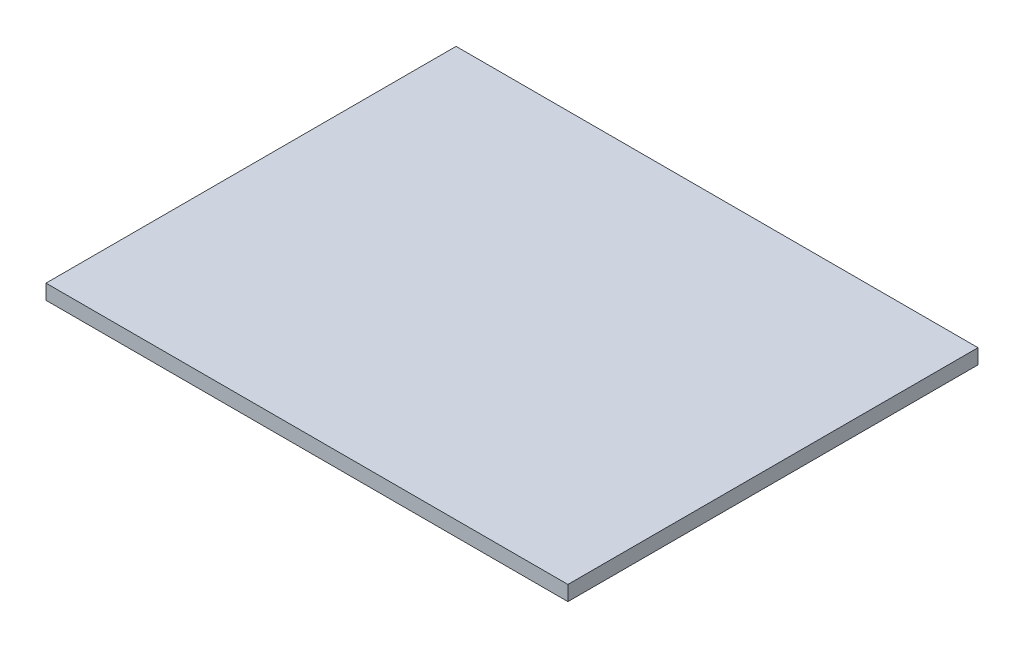
ISO-10303-21;
HEADER;
FILE_DESCRIPTION(('STEP AP214'),'2;1');
FILE_NAME('part.step','',(''),(''),'','','');
FILE_SCHEMA(('AUTOMOTIVE_DESIGN { 1 0 10303 214 1 1 1 1 }'));
ENDSEC;
DATA;
#1=APPLICATION_CONTEXT('core data for automotive mechanical design processes');
#2=APPLICATION_PROTOCOL_DEFINITION('international standard','automotive_design',2000,#1);
#3=PRODUCT_CONTEXT('',#1,'mechanical');
#4=PRODUCT('Part','Part','',(#3));
#5=PRODUCT_RELATED_PRODUCT_CATEGORY('part','',(#4));
#6=PRODUCT_DEFINITION_FORMATION('','',#4);
#7=PRODUCT_DEFINITION_CONTEXT('part definition',#1,'design');
#8=PRODUCT_DEFINITION('design','',#6,#7);
#9=PRODUCT_DEFINITION_SHAPE('','',#8);
#10=(LENGTH_UNIT() NAMED_UNIT(*) SI_UNIT(.MILLI.,.METRE.));
#11=(NAMED_UNIT(*) PLANE_ANGLE_UNIT() SI_UNIT($,.RADIAN.));
#12=(NAMED_UNIT(*) SI_UNIT($,.STERADIAN.) SOLID_ANGLE_UNIT());
#13=UNCERTAINTY_MEASURE_WITH_UNIT(LENGTH_MEASURE(1.E-05),#10,'distance_accuracy_value','');
#14=(GEOMETRIC_REPRESENTATION_CONTEXT(3) GLOBAL_UNCERTAINTY_ASSIGNED_CONTEXT((#13)) GLOBAL_UNIT_ASSIGNED_CONTEXT((#10,
#11,#12)) REPRESENTATION_CONTEXT('',''));
#15=CARTESIAN_POINT('',(0.,0.,0.));
#16=DIRECTION('',(0.,0.,1.));
#17=DIRECTION('',(1.,0.,0.));
#18=AXIS2_PLACEMENT_3D('',#15,#16,#17);
#19=CARTESIAN_POINT('',(-35.,2.,-27.5));
#20=DIRECTION('',(1.,0.,0.));
#21=DIRECTION('',(0.,0.,-1.));
#22=AXIS2_PLACEMENT_3D('',#19,#20,#21);
#23=PLANE('',#22);
#24=DIRECTION('',(0.,0.,1.));
#25=VECTOR('',#24,1.);
#26=CARTESIAN_POINT('',(-35.,0.,-27.5));
#27=LINE('',#26,#25);
#28=CARTESIAN_POINT('',(-35.,0.,-27.5));
#29=VERTEX_POINT('',#28);
#30=CARTESIAN_POINT('',(-35.,0.,27.5));
#31=VERTEX_POINT('',#30);
#32=EDGE_CURVE('E107',#29,#31,#27,.T.);
#33=ORIENTED_EDGE('',*,*,#32,.T.);
#34=DIRECTION('',(0.,-1.,0.));
#35=VECTOR('',#34,1.);
#36=CARTESIAN_POINT('',(-35.,2.,27.5));
#37=LINE('',#36,#35);
#38=CARTESIAN_POINT('',(-35.,2.,27.5));
#39=VERTEX_POINT('',#38);
#40=EDGE_CURVE('E11',#39,#31,#37,.T.);
#41=ORIENTED_EDGE('',*,*,#40,.F.);
#42=DIRECTION('',(0.,0.,1.));
#43=VECTOR('',#42,1.);
#44=CARTESIAN_POINT('',(-35.,2.,-27.5));
#45=LINE('',#44,#43);
#46=CARTESIAN_POINT('',(-35.,2.,-27.5));
#47=VERTEX_POINT('',#46);
#48=EDGE_CURVE('E91',#47,#39,#45,.T.);
#49=ORIENTED_EDGE('',*,*,#48,.F.);
#50=DIRECTION('',(0.,-1.,0.));
#51=VECTOR('',#50,1.);
#52=CARTESIAN_POINT('',(-35.,2.,-27.5));
#53=LINE('',#52,#51);
#54=EDGE_CURVE('E103',#47,#29,#53,.T.);
#55=ORIENTED_EDGE('',*,*,#54,.T.);
#56=EDGE_LOOP('',(#33,#41,#49,#55));
#57=FACE_BOUND('',#56,.T.);
#58=ADVANCED_FACE('F39',(#57),#23,.F.);
#59=CARTESIAN_POINT('',(-35.,2.,27.5));
#60=DIRECTION('',(0.,0.,-1.));
#61=DIRECTION('',(-1.,0.,0.));
#62=AXIS2_PLACEMENT_3D('',#59,#60,#61);
#63=PLANE('',#62);
#64=DIRECTION('',(1.,0.,0.));
#65=VECTOR('',#64,1.);
#66=CARTESIAN_POINT('',(-35.,0.,27.5));
#67=LINE('',#66,#65);
#68=CARTESIAN_POINT('',(35.,0.,27.5));
#69=VERTEX_POINT('',#68);
#70=EDGE_CURVE('E96',#31,#69,#67,.T.);
#71=ORIENTED_EDGE('',*,*,#70,.T.);
#72=DIRECTION('',(0.,-1.,0.));
#73=VECTOR('',#72,1.);
#74=CARTESIAN_POINT('',(35.,2.,27.5));
#75=LINE('',#74,#73);
#76=CARTESIAN_POINT('',(35.,2.,27.5));
#77=VERTEX_POINT('',#76);
#78=EDGE_CURVE('E48',#77,#69,#75,.T.);
#79=ORIENTED_EDGE('',*,*,#78,.F.);
#80=DIRECTION('',(1.,0.,0.));
#81=VECTOR('',#80,1.);
#82=CARTESIAN_POINT('',(-35.,2.,27.5));
#83=LINE('',#82,#81);
#84=EDGE_CURVE('E86',#39,#77,#83,.T.);
#85=ORIENTED_EDGE('',*,*,#84,.F.);
#86=ORIENTED_EDGE('',*,*,#40,.T.);
#87=EDGE_LOOP('',(#71,#79,#85,#86));
#88=FACE_BOUND('',#87,.T.);
#89=ADVANCED_FACE('F95',(#88),#63,.F.);
#90=CARTESIAN_POINT('',(35.,2.,-27.5));
#91=DIRECTION('',(-1.,0.,0.));
#92=DIRECTION('',(0.,0.,1.));
#93=AXIS2_PLACEMENT_3D('',#90,#91,#92);
#94=PLANE('',#93);
#95=DIRECTION('',(0.,0.,-1.));
#96=VECTOR('',#95,1.);
#97=CARTESIAN_POINT('',(35.,0.,-27.5));
#98=LINE('',#97,#96);
#99=CARTESIAN_POINT('',(35.,0.,-27.5));
#100=VERTEX_POINT('',#99);
#101=EDGE_CURVE('E73',#69,#100,#98,.T.);
#102=ORIENTED_EDGE('',*,*,#101,.T.);
#103=DIRECTION('',(0.,-1.,0.));
#104=VECTOR('',#103,1.);
#105=CARTESIAN_POINT('',(35.,2.,-27.5));
#106=LINE('',#105,#104);
#107=CARTESIAN_POINT('',(35.,2.,-27.5));
#108=VERTEX_POINT('',#107);
#109=EDGE_CURVE('E98',#108,#100,#106,.T.);
#110=ORIENTED_EDGE('',*,*,#109,.F.);
#111=DIRECTION('',(0.,0.,-1.));
#112=VECTOR('',#111,1.);
#113=CARTESIAN_POINT('',(35.,2.,-27.5));
#114=LINE('',#113,#112);
#115=EDGE_CURVE('E89',#77,#108,#114,.T.);
#116=ORIENTED_EDGE('',*,*,#115,.F.);
#117=ORIENTED_EDGE('',*,*,#78,.T.);
#118=EDGE_LOOP('',(#102,#110,#116,#117));
#119=FACE_BOUND('',#118,.T.);
#120=ADVANCED_FACE('F99',(#119),#94,.F.);
#121=CARTESIAN_POINT('',(-35.,2.,-27.5));
#122=DIRECTION('',(0.,0.,1.));
#123=DIRECTION('',(1.,0.,0.));
#124=AXIS2_PLACEMENT_3D('',#121,#122,#123);
#125=PLANE('',#124);
#126=DIRECTION('',(-1.,0.,0.));
#127=VECTOR('',#126,1.);
#128=CARTESIAN_POINT('',(-35.,0.,-27.5));
#129=LINE('',#128,#127);
#130=EDGE_CURVE('E79',#100,#29,#129,.T.);
#131=ORIENTED_EDGE('',*,*,#130,.T.);
#132=ORIENTED_EDGE('',*,*,#54,.F.);
#133=DIRECTION('',(-1.,0.,0.));
#134=VECTOR('',#133,1.);
#135=CARTESIAN_POINT('',(-35.,2.,-27.5));
#136=LINE('',#135,#134);
#137=EDGE_CURVE('E56',#108,#47,#136,.T.);
#138=ORIENTED_EDGE('',*,*,#137,.F.);
#139=ORIENTED_EDGE('',*,*,#109,.T.);
#140=EDGE_LOOP('',(#131,#132,#138,#139));
#141=FACE_BOUND('',#140,.T.);
#142=ADVANCED_FACE('F120',(#141),#125,.F.);
#143=CARTESIAN_POINT('',(0.,2.,0.));
#144=DIRECTION('',(0.,1.,0.));
#145=DIRECTION('',(0.,0.,1.));
#146=AXIS2_PLACEMENT_3D('',#143,#144,#145);
#147=PLANE('',#146);
#148=ORIENTED_EDGE('',*,*,#48,.T.);
#149=ORIENTED_EDGE('',*,*,#84,.T.);
#150=ORIENTED_EDGE('',*,*,#115,.T.);
#151=ORIENTED_EDGE('',*,*,#137,.T.);
#152=EDGE_LOOP('',(#148,#149,#150,#151));
#153=FACE_BOUND('',#152,.T.);
#154=ADVANCED_FACE('F87',(#153),#147,.T.);
#155=CARTESIAN_POINT('',(0.,0.,0.));
#156=DIRECTION('',(0.,1.,0.));
#157=DIRECTION('',(0.,0.,1.));
#158=AXIS2_PLACEMENT_3D('',#155,#156,#157);
#159=PLANE('',#158);
#160=ORIENTED_EDGE('',*,*,#32,.F.);
#161=ORIENTED_EDGE('',*,*,#130,.F.);
#162=ORIENTED_EDGE('',*,*,#101,.F.);
#163=ORIENTED_EDGE('',*,*,#70,.F.);
#164=EDGE_LOOP('',(#160,#161,#162,#163));
#165=FACE_BOUND('',#164,.T.);
#166=ADVANCED_FACE('F123',(#165),#159,.F.);
#167=CLOSED_SHELL('',(#58,#89,#120,#142,#154,#166));
#168=MANIFOLD_SOLID_BREP('B2',#167);
#169=ADVANCED_BREP_SHAPE_REPRESENTATION('',(#18,#168),#14);
#170=SHAPE_DEFINITION_REPRESENTATION(#9,#169);
ENDSEC;
END-ISO-10303-21;
